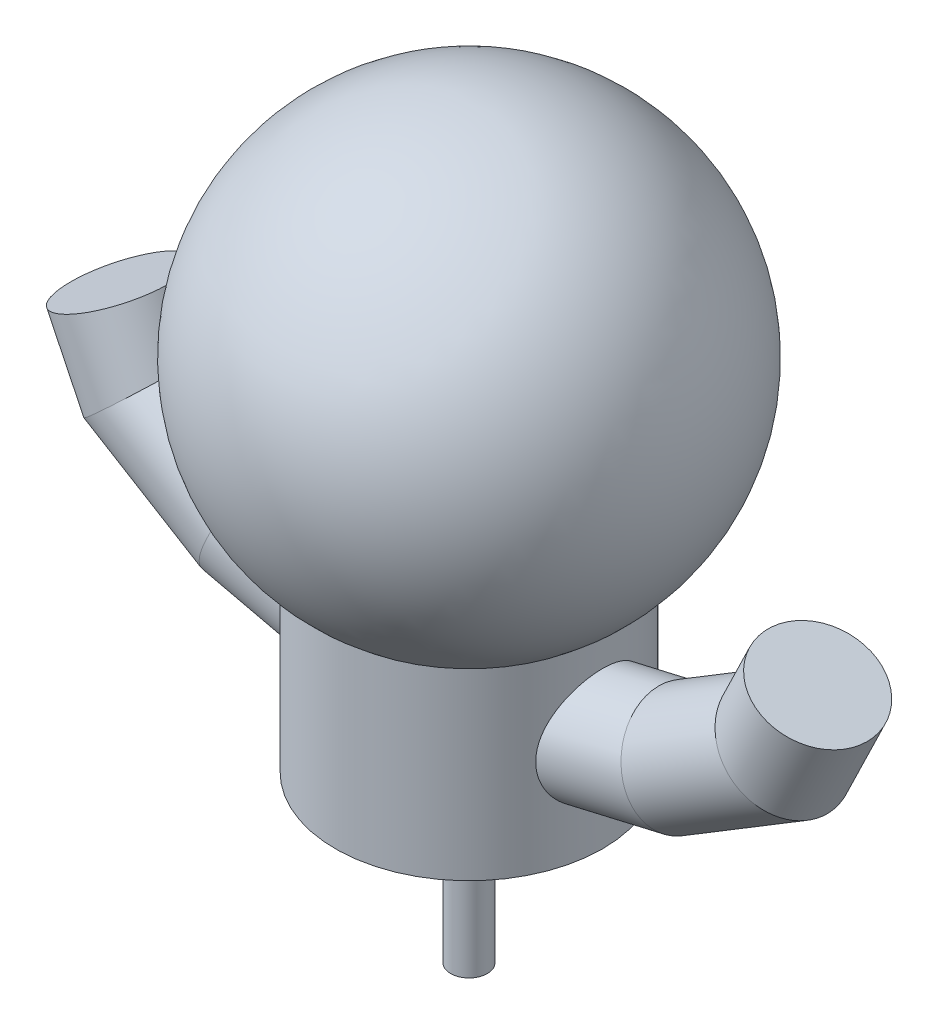
ISO-10303-21;
HEADER;
FILE_DESCRIPTION(('STEP AP214'),'2;1');
FILE_NAME('part.step','',(''),(''),'','','');
FILE_SCHEMA(('AUTOMOTIVE_DESIGN { 1 0 10303 214 1 1 1 1 }'));
ENDSEC;
DATA;
#1=APPLICATION_CONTEXT('core data for automotive mechanical design processes');
#2=APPLICATION_PROTOCOL_DEFINITION('international standard','automotive_design',2000,#1);
#3=PRODUCT_CONTEXT('',#1,'mechanical');
#4=PRODUCT('Part','Part','',(#3));
#5=PRODUCT_RELATED_PRODUCT_CATEGORY('part','',(#4));
#6=PRODUCT_DEFINITION_FORMATION('','',#4);
#7=PRODUCT_DEFINITION_CONTEXT('part definition',#1,'design');
#8=PRODUCT_DEFINITION('design','',#6,#7);
#9=PRODUCT_DEFINITION_SHAPE('','',#8);
#10=(LENGTH_UNIT() NAMED_UNIT(*) SI_UNIT(.MILLI.,.METRE.));
#11=(NAMED_UNIT(*) PLANE_ANGLE_UNIT() SI_UNIT($,.RADIAN.));
#12=(NAMED_UNIT(*) SI_UNIT($,.STERADIAN.) SOLID_ANGLE_UNIT());
#13=UNCERTAINTY_MEASURE_WITH_UNIT(LENGTH_MEASURE(1.E-05),#10,'distance_accuracy_value','');
#14=(GEOMETRIC_REPRESENTATION_CONTEXT(3) GLOBAL_UNCERTAINTY_ASSIGNED_CONTEXT((#13)) GLOBAL_UNIT_ASSIGNED_CONTEXT((#10,
#11,#12)) REPRESENTATION_CONTEXT('',''));
#15=CARTESIAN_POINT('',(0.,0.,0.));
#16=DIRECTION('',(0.,0.,1.));
#17=DIRECTION('',(1.,0.,0.));
#18=AXIS2_PLACEMENT_3D('',#15,#16,#17);
#19=CARTESIAN_POINT('',(0.,0.,0.));
#20=DIRECTION('',(0.,-1.,0.));
#21=DIRECTION('',(1.,0.,0.));
#22=AXIS2_PLACEMENT_3D('',#19,#20,#21);
#23=SPHERICAL_SURFACE('',#22,6.);
#24=CARTESIAN_POINT('',(0.,-4.76969600708473,0.));
#25=DIRECTION('',(0.,-1.,0.));
#26=DIRECTION('',(1.,0.,0.));
#27=AXIS2_PLACEMENT_3D('',#24,#25,#26);
#28=CIRCLE('',#27,3.64005494464026);
#29=CARTESIAN_POINT('',(3.64005494464026,-4.76969600708473,0.));
#30=VERTEX_POINT('',#29);
#31=EDGE_CURVE('E130',#30,#30,#28,.T.);
#32=ORIENTED_EDGE('',*,*,#31,.F.);
#33=EDGE_LOOP('',(#32));
#34=FACE_BOUND('',#33,.T.);
#35=ADVANCED_FACE('F52',(#34),#23,.T.);
#36=CARTESIAN_POINT('',(0.,0.,0.));
#37=DIRECTION('',(0.,-1.,0.));
#38=DIRECTION('',(1.,0.,0.));
#39=AXIS2_PLACEMENT_3D('',#36,#37,#38);
#40=CYLINDRICAL_SURFACE('',#39,3.64005494464026);
#41=CARTESIAN_POINT('',(-3.64005494464026,-8.59607727363371,0.));
#42=CARTESIAN_POINT('',(-3.64005134271099,-8.59607407344237,0.0835690940158541));
#43=CARTESIAN_POINT('',(-3.63714720886896,-8.58955207200604,0.167246571966957));
#44=CARTESIAN_POINT('',(-3.62580345714482,-8.56359165513654,0.332300949752981));
#45=CARTESIAN_POINT('',(-3.61735242224687,-8.54412659832796,0.41367274273313));
#46=CARTESIAN_POINT('',(-3.5957769928552,-8.49275472153984,0.571600855199424));
#47=CARTESIAN_POINT('',(-3.58265975892055,-8.46086695784621,0.648164342679608));
#48=CARTESIAN_POINT('',(-3.55307306152884,-8.3853379603814,0.794512721836508));
#49=CARTESIAN_POINT('',(-3.5366044789548,-8.34169981415963,0.864299387656839));
#50=CARTESIAN_POINT('',(-3.50179637303754,-8.24294106788351,0.996053851440424));
#51=CARTESIAN_POINT('',(-3.4834369637112,-8.18769033166273,1.05791901767543));
#52=CARTESIAN_POINT('',(-3.44703927918594,-8.06715831932314,1.17109400325693));
#53=CARTESIAN_POINT('',(-3.42900098304577,-8.00187769999261,1.2224045132413));
#54=CARTESIAN_POINT('',(-3.39564705753739,-7.86390703742525,1.31219198271849));
#55=CARTESIAN_POINT('',(-3.38029292741164,-7.79135029683467,1.35085882868813));
#56=CARTESIAN_POINT('',(-3.35384526821888,-7.64000743778165,1.415254464205));
#57=CARTESIAN_POINT('',(-3.34274943943768,-7.56122470949359,1.44099023956226));
#58=CARTESIAN_POINT('',(-3.32657775610414,-7.40418178226307,1.47792663684957));
#59=CARTESIAN_POINT('',(-3.32121514913378,-7.32611335602492,1.48982255615068));
#60=CARTESIAN_POINT('',(-3.31592869559485,-7.16890670272557,1.50155197479597));
#61=CARTESIAN_POINT('',(-3.31600551127798,-7.08976834657274,1.50138400535723));
#62=CARTESIAN_POINT('',(-3.32135548330058,-6.93198874451914,1.48950866492087));
#63=CARTESIAN_POINT('',(-3.32666706510584,-6.85335550338628,1.47771596317766));
#64=CARTESIAN_POINT('',(-3.34173493070549,-6.69895027846491,1.44331379012822));
#65=CARTESIAN_POINT('',(-3.35149286372745,-6.62317936766654,1.42070030505254));
#66=CARTESIAN_POINT('',(-3.37559637586218,-6.46792206623965,1.36251376003788));
#67=CARTESIAN_POINT('',(-3.39032436420688,-6.38892208447144,1.32580235420734));
#68=CARTESIAN_POINT('',(-3.42224330113159,-6.23770533281707,1.24108716696404));
#69=CARTESIAN_POINT('',(-3.43943657138977,-6.16549506449303,1.193072713243));
#70=CARTESIAN_POINT('',(-3.47635461223282,-6.02253573851541,1.08110075545232));
#71=CARTESIAN_POINT('',(-3.49615904925927,-5.95268146342705,1.01601871368585));
#72=CARTESIAN_POINT('',(-3.5343004811491,-5.82563619426501,0.874123831088594));
#73=CARTESIAN_POINT('',(-3.55263906410411,-5.76843137383105,0.797323955112624));
#74=CARTESIAN_POINT('',(-3.58204977274425,-5.67984880152984,0.650611071648093));
#75=CARTESIAN_POINT('',(-3.59383989179968,-5.64557376573318,0.582590283147357));
#76=CARTESIAN_POINT('',(-3.61388568553978,-5.58830303599787,0.441466369275734));
#77=CARTESIAN_POINT('',(-3.62214433467646,-5.5652978474141,0.36836758152474));
#78=CARTESIAN_POINT('',(-3.63426391424514,-5.53178609483416,0.218607191437487));
#79=CARTESIAN_POINT('',(-3.63810402920059,-5.52133867961148,0.141930481913186));
#80=CARTESIAN_POINT('',(-3.64084926514996,-5.51385407138768,-0.0121655350369675));
#81=CARTESIAN_POINT('',(-3.6397553008023,-5.51681439291841,-0.0895847021741608));
#82=CARTESIAN_POINT('',(-3.63305131367646,-5.53516558637919,-0.236479829783757));
#83=CARTESIAN_POINT('',(-3.6278039404992,-5.54955857295678,-0.306100993177752));
#84=CARTESIAN_POINT('',(-3.61377071465294,-5.58873570120773,-0.441960846283877));
#85=CARTESIAN_POINT('',(-3.60498426912019,-5.61352158392278,-0.508198967174374));
#86=CARTESIAN_POINT('',(-3.5841964165547,-5.67368788120705,-0.638836394583466));
#87=CARTESIAN_POINT('',(-3.57206721965398,-5.70949799579491,-0.703015883566969));
#88=CARTESIAN_POINT('',(-3.54583875411319,-5.78984467461402,-0.825190435953852));
#89=CARTESIAN_POINT('',(-3.53173863504565,-5.83438500917746,-0.883182810549112));
#90=CARTESIAN_POINT('',(-3.50052931041012,-5.93790707897939,-1.00023817890334));
#91=CARTESIAN_POINT('',(-3.48328002412369,-5.99804604610502,-1.05824031018409));
#92=CARTESIAN_POINT('',(-3.44917694150512,-6.12645221876781,-1.1646048106477));
#93=CARTESIAN_POINT('',(-3.43232348843751,-6.19472618844312,-1.21295906715633));
#94=CARTESIAN_POINT('',(-3.3985272548193,-6.34719172887997,-1.30488005114661));
#95=CARTESIAN_POINT('',(-3.38185109373607,-6.43230142750177,-1.34703391620695));
#96=CARTESIAN_POINT('',(-3.35316995669626,-6.60902652715516,-1.41692908096207));
#97=CARTESIAN_POINT('',(-3.34116485841944,-6.70064175775331,-1.44467075807246));
#98=CARTESIAN_POINT('',(-3.32392384890707,-6.88642018818435,-1.48391120329772));
#99=CARTESIAN_POINT('',(-3.31858188576581,-6.9805184631374,-1.49566472381707));
#100=CARTESIAN_POINT('',(-3.31557095609376,-7.16940898711521,-1.50233728309675));
#101=CARTESIAN_POINT('',(-3.31789224530079,-7.26420020202618,-1.49727770062203));
#102=CARTESIAN_POINT('',(-3.32942170383373,-7.43892569624402,-1.47143014293076));
#103=CARTESIAN_POINT('',(-3.3377267869483,-7.51922886951134,-1.45270082697048));
#104=CARTESIAN_POINT('',(-3.3592703191043,-7.67490594894049,-1.40215989858955));
#105=CARTESIAN_POINT('',(-3.37250837357849,-7.75028024877514,-1.37034933246098));
#106=CARTESIAN_POINT('',(-3.40153149222102,-7.89008168940454,-1.29655706880628));
#107=CARTESIAN_POINT('',(-3.41714568629201,-7.95487631524828,-1.25519931432179));
#108=CARTESIAN_POINT('',(-3.44972321287994,-8.07663452419111,-1.16267403298825));
#109=CARTESIAN_POINT('',(-3.4666866404259,-8.13359755492415,-1.11150581481147));
#110=CARTESIAN_POINT('',(-3.50104879969816,-8.24098261198177,-0.998155062724675));
#111=CARTESIAN_POINT('',(-3.51843288222428,-8.29099615289931,-0.935581165762407));
#112=CARTESIAN_POINT('',(-3.55110429190529,-8.38038775958931,-0.802706537963184));
#113=CARTESIAN_POINT('',(-3.56639030409198,-8.41975917024047,-0.732401010582463));
#114=CARTESIAN_POINT('',(-3.59386024464513,-8.48830453051474,-0.583205059555492));
#115=CARTESIAN_POINT('',(-3.60591080678036,-8.51705451636795,-0.504095135829281));
#116=CARTESIAN_POINT('',(-3.62488450324746,-8.56158343026559,-0.341835888366846));
#117=CARTESIAN_POINT('',(-3.63181844943693,-8.57738971728667,-0.258695480151701));
#118=CARTESIAN_POINT('',(-3.63725109731717,-8.58973206147873,-0.14579657611972));
#119=CARTESIAN_POINT('',(-3.63830051798698,-8.59210986807378,-0.116701696257366));
#120=CARTESIAN_POINT('',(-3.63970307218496,-8.59528303577263,-0.0584089586246372));
#121=CARTESIAN_POINT('',(-3.64005620367411,-8.59607839224235,-0.0292111005529483));
#122=CARTESIAN_POINT('',(-3.64005494464026,-8.59607727363371,0.));
#123=B_SPLINE_CURVE_WITH_KNOTS('',3,(#41,#42,#43,#44,#45,#46,#47,#48,#49,#50,#51,#52,#53,#54,
#55,#56,#57,#58,#59,#60,#61,#62,#63,#64,#65,#66,#67,#68,#69,#70,#71,#72,#73,#74,#75,#76,#77,#78,
#79,#80,#81,#82,#83,#84,#85,#86,#87,#88,#89,#90,#91,#92,#93,#94,#95,#96,#97,#98,#99,#100,#101,
#102,#103,#104,#105,#106,#107,#108,#109,#110,#111,#112,#113,#114,#115,#116,#117,#118,#119,#120,
#121,#122),.UNSPECIFIED.,.T.,.F.,(4,2,2,2,2,2,2,2,2,2,2,2,2,2,2,2,2,2,2,2,2,2,2,2,2,2,2,2,2,2,2,
2,2,2,2,2,2,2,2,2,4),(0.,0.250595032176578,0.501707480720927,0.752436232957427,1.00309916748549,
1.25673718116394,1.51035859290116,1.75997447070413,2.00945535202431,2.24577232954304,
2.48211807878991,2.72021172892935,2.95839376404678,3.22237253898773,3.48660156883981,
3.77769147390713,4.06846161579711,4.29872816326529,4.52880038021484,4.759952073764,
4.99106091916756,5.20395881686657,5.41689239396551,5.63948794840792,5.86217984815979,
6.11711696417195,6.37226755573091,6.66019354510001,6.94811199409815,7.23138684328873,
7.51430163116933,7.76162646562468,8.0089315218713,8.24321133281505,8.47750765915507,
8.72232301152972,8.96729110833411,9.22118749293776,9.47454582373419,9.56213963257862,
9.64973369793478),.UNSPECIFIED.);
#124=CARTESIAN_POINT('',(-3.64005494464026,-8.59607727363371,0.));
#125=VERTEX_POINT('',#124);
#126=EDGE_CURVE('E12',#125,#125,#123,.T.);
#127=ORIENTED_EDGE('',*,*,#126,.F.);
#128=EDGE_LOOP('',(#127));
#129=FACE_BOUND('',#128,.T.);
#130=CARTESIAN_POINT('',(3.64005494464026,-5.5160205218229,0.));
#131=CARTESIAN_POINT('',(3.64005206407755,-5.51602561847694,0.075332153520379));
#132=CARTESIAN_POINT('',(3.6376875742345,-5.52244083422874,0.150788612179093));
#133=CARTESIAN_POINT('',(3.62848943879027,-5.54771789245026,0.29940219232951));
#134=CARTESIAN_POINT('',(3.62164461072528,-5.56661087921812,0.372553079249521));
#135=CARTESIAN_POINT('',(3.60427548610926,-5.61561452748231,0.514057809054224));
#136=CARTESIAN_POINT('',(3.59377083954549,-5.64566533687485,0.582434974862623));
#137=CARTESIAN_POINT('',(3.57008414534517,-5.71556420675062,0.713397481154407));
#138=CARTESIAN_POINT('',(3.5569025305712,-5.75541068350507,0.77598375563947));
#139=CARTESIAN_POINT('',(3.52782640316797,-5.84706055047559,0.899319350649689));
#140=CARTESIAN_POINT('',(3.5117986674186,-5.89957066548856,0.959510015956166));
#141=CARTESIAN_POINT('',(3.47928475817384,-6.01282466149621,1.07143866491105));
#142=CARTESIAN_POINT('',(3.46279828190979,-6.07357408805382,1.12317090334726));
#143=CARTESIAN_POINT('',(3.4283163710591,-6.21165869072769,1.22472087883033));
#144=CARTESIAN_POINT('',(3.41046820492509,-6.29011356395069,1.27307395856151));
#145=CARTESIAN_POINT('',(3.3780201049491,-6.45433641151377,1.3568360157967));
#146=CARTESIAN_POINT('',(3.3634219396578,-6.54010833262504,1.39223795239291));
#147=CARTESIAN_POINT('',(3.3390334892627,-6.72000636901913,1.449784748987));
#148=CARTESIAN_POINT('',(3.32942395873215,-6.81431755284925,1.4714368334028));
#149=CARTESIAN_POINT('',(3.31761150602155,-7.00570947528485,1.49789296971459));
#150=CARTESIAN_POINT('',(3.31539910604132,-7.10278650900302,1.50271858138491));
#151=CARTESIAN_POINT('',(3.31897197921092,-7.28517511380399,1.49480098073752));
#152=CARTESIAN_POINT('',(3.32388927561267,-7.37058669608874,1.48396492160292));
#153=CARTESIAN_POINT('',(3.33976870817501,-7.53771628016345,1.44787106926828));
#154=CARTESIAN_POINT('',(3.35072856241568,-7.61943566368365,1.4226187201284));
#155=CARTESIAN_POINT('',(3.37612952773533,-7.76949868990039,1.36115433360866));
#156=CARTESIAN_POINT('',(3.39018104740495,-7.83838685940344,1.32609765488617));
#157=CARTESIAN_POINT('',(3.42062848671948,-7.96911350767591,1.24545314015555));
#158=CARTESIAN_POINT('',(3.43702468080793,-8.03095115965903,1.19986407094875));
#159=CARTESIAN_POINT('',(3.47092344237607,-8.14782881441846,1.09801632990885));
#160=CARTESIAN_POINT('',(3.48844385523404,-8.20264350326018,1.04150549724072));
#161=CARTESIAN_POINT('',(3.52240964296511,-8.30245989814092,0.920109456382534));
#162=CARTESIAN_POINT('',(3.53885478119316,-8.34745944913298,0.855222414050069));
#163=CARTESIAN_POINT('',(3.56980491688371,-8.42870088566679,0.715435880337415));
#164=CARTESIAN_POINT('',(3.58418152427537,-8.46442849372465,0.640208161096084));
#165=CARTESIAN_POINT('',(3.60854755953393,-8.52345971992588,0.484357678447985));
#166=CARTESIAN_POINT('',(3.618537041876,-8.54676349233745,0.403734982045257));
#167=CARTESIAN_POINT('',(3.63311955947945,-8.58042452948414,0.239286428738883));
#168=CARTESIAN_POINT('',(3.63770849234972,-8.59077195263661,0.155458186664315));
#169=CARTESIAN_POINT('',(3.64100539184216,-8.59822752215712,-0.0128952448507212));
#170=CARTESIAN_POINT('',(3.63971388909882,-8.59533686309348,-0.0974203707192377));
#171=CARTESIAN_POINT('',(3.63144923888713,-8.57654038089901,-0.263395809377436));
#172=CARTESIAN_POINT('',(3.62456389743933,-8.56083568233813,-0.344873428507342));
#173=CARTESIAN_POINT('',(3.60590525844523,-8.51703678599593,-0.503840767634385));
#174=CARTESIAN_POINT('',(3.59413153805895,-8.48894151642931,-0.581330142000402));
#175=CARTESIAN_POINT('',(3.56673623287665,-8.42066080749181,-0.730909656459056));
#176=CARTESIAN_POINT('',(3.55108113442818,-8.38036935307706,-0.802945232033433));
#177=CARTESIAN_POINT('',(3.51757077928485,-8.28859132165221,-0.938938841256403));
#178=CARTESIAN_POINT('',(3.4997151330199,-8.23710276114512,-1.00289544058779));
#179=CARTESIAN_POINT('',(3.46348578242838,-8.12327382096668,-1.1216830279688));
#180=CARTESIAN_POINT('',(3.44510844957381,-8.06081239278901,-1.17639724491673));
#181=CARTESIAN_POINT('',(3.41018147135059,-7.92686979951978,-1.27411292658893));
#182=CARTESIAN_POINT('',(3.39363113167304,-7.85539208315278,-1.31711884996828));
#183=CARTESIAN_POINT('',(3.36491369506988,-7.70791866934569,-1.38881407430412));
#184=CARTESIAN_POINT('',(3.35261474905273,-7.63216487102751,-1.41794725347008));
#185=CARTESIAN_POINT('',(3.33308439154402,-7.47627877517531,-1.46327245267323));
#186=CARTESIAN_POINT('',(3.32585119049142,-7.39614803466573,-1.47946904306589));
#187=CARTESIAN_POINT('',(3.31737053257249,-7.23765071625341,-1.4983834677057));
#188=CARTESIAN_POINT('',(3.31587191378812,-7.15936343003437,-1.50166705003416));
#189=CARTESIAN_POINT('',(3.31808936749014,-7.00323707184262,-1.49675882617192));
#190=CARTESIAN_POINT('',(3.32180688191296,-6.92539812978258,-1.48856384687388));
#191=CARTESIAN_POINT('',(3.3341029910931,-6.76844838162318,-1.4608198044599));
#192=CARTESIAN_POINT('',(3.34289892497179,-6.68944586681702,-1.44076205108));
#193=CARTESIAN_POINT('',(3.36438142213141,-6.53556283091164,-1.38985454962886));
#194=CARTESIAN_POINT('',(3.37706983878496,-6.46068429348547,-1.358999659606));
#195=CARTESIAN_POINT('',(3.40677085027455,-6.30742799255783,-1.28287998240655));
#196=CARTESIAN_POINT('',(3.42412439903201,-6.22976577858891,-1.2363036362654));
#197=CARTESIAN_POINT('',(3.4601816345181,-6.08302796002916,-1.13146545114868));
#198=CARTESIAN_POINT('',(3.47888646839146,-6.0139597898371,-1.07319360711102));
#199=CARTESIAN_POINT('',(3.51676283389293,-5.88257215985816,-0.941975531068552));
#200=CARTESIAN_POINT('',(3.53589531794094,-5.82090383029634,-0.868359862270871));
#201=CARTESIAN_POINT('',(3.5710006020928,-5.71232718644217,-0.710256779020208));
#202=CARTESIAN_POINT('',(3.58697772763944,-5.66539861365627,-0.625784513169807));
#203=CARTESIAN_POINT('',(3.61016708870077,-5.59880840635672,-0.470385054469701));
#204=CARTESIAN_POINT('',(3.61856998220217,-5.57527265365965,-0.401281447357137));
#205=CARTESIAN_POINT('',(3.63144805196664,-5.53951571482703,-0.259958833576038));
#206=CARTESIAN_POINT('',(3.6359346357854,-5.52726166124362,-0.187749522395355));
#207=CARTESIAN_POINT('',(3.63884145886494,-5.51932853197513,-0.0959363664743382));
#208=CARTESIAN_POINT('',(3.63929569957311,-5.51808950540125,-0.0767763925971019));
#209=CARTESIAN_POINT('',(3.63990283154662,-5.51643479092332,-0.0384136443127323));
#210=CARTESIAN_POINT('',(3.6400556792283,-5.5160192220973,-0.0192108641173801));
#211=CARTESIAN_POINT('',(3.64005494464026,-5.5160205218229,0.));
#212=B_SPLINE_CURVE_WITH_KNOTS('',3,(#130,#131,#132,#133,#134,#135,#136,#137,#138,#139,#140,
#141,#142,#143,#144,#145,#146,#147,#148,#149,#150,#151,#152,#153,#154,#155,#156,#157,#158,#159,
#160,#161,#162,#163,#164,#165,#166,#167,#168,#169,#170,#171,#172,#173,#174,#175,#176,#177,#178,
#179,#180,#181,#182,#183,#184,#185,#186,#187,#188,#189,#190,#191,#192,#193,#194,#195,#196,#197,
#198,#199,#200,#201,#202,#203,#204,#205,#206,#207,#208,#209,#210,#211),.UNSPECIFIED.,.T.,.F.,(4,
2,2,2,2,2,2,2,2,2,2,2,2,2,2,2,2,2,2,2,2,2,2,2,2,2,2,2,2,2,2,2,2,2,2,2,2,2,2,2,4),(0.,
0.225914104423408,0.452394228384957,0.677676631500902,0.902922635682854,1.14639914301043,
1.39004034583779,1.67041605282258,1.95094396074425,2.24102969898867,2.53074361326523,
2.78800996679492,3.04517923238289,3.27979524037599,3.51443873262502,3.75534100799938,
3.99629612361785,4.24863661813012,4.50097397922858,4.75350289856451,5.0060090308307,
5.25462646278348,5.50326540438148,5.75413092035847,6.00504091183691,6.25891597175021,
6.51269421741008,6.75769155574265,7.00260230085981,7.23665486057815,7.47077213402186,
7.7157414930469,7.96082767366509,8.23627396736519,8.51195690720555,8.80413609581394,
9.09591193468221,9.31545739111601,9.53436119361981,9.5919644546353,9.64957604489873),.UNSPECIFIED.);
#213=CARTESIAN_POINT('',(3.64005494464026,-5.5160205218229,0.));
#214=VERTEX_POINT('',#213);
#215=EDGE_CURVE('E67',#214,#214,#212,.T.);
#216=ORIENTED_EDGE('',*,*,#215,.F.);
#217=EDGE_LOOP('',(#216));
#218=FACE_BOUND('',#217,.T.);
#219=ORIENTED_EDGE('',*,*,#31,.T.);
#220=EDGE_LOOP('',(#219));
#221=FACE_BOUND('',#220,.T.);
#222=CARTESIAN_POINT('',(0.,-9.76969600708473,0.));
#223=DIRECTION('',(0.,-1.,0.));
#224=DIRECTION('',(1.,0.,0.));
#225=AXIS2_PLACEMENT_3D('',#222,#223,#224);
#226=CIRCLE('',#225,3.64005494464026);
#227=CARTESIAN_POINT('',(3.64005494464026,-9.76969600708473,0.));
#228=VERTEX_POINT('',#227);
#229=EDGE_CURVE('E126',#228,#228,#226,.T.);
#230=ORIENTED_EDGE('',*,*,#229,.F.);
#231=EDGE_LOOP('',(#230));
#232=FACE_BOUND('',#231,.T.);
#233=ADVANCED_FACE('F139',(#129,#218,#221,#232),#40,.T.);
#234=CARTESIAN_POINT('',(0.500000000000001,-9.76969600708473,0.));
#235=DIRECTION('',(0.,-1.,0.));
#236=DIRECTION('',(1.,0.,0.));
#237=AXIS2_PLACEMENT_3D('',#234,#235,#236);
#238=PLANE('',#237);
#239=ORIENTED_EDGE('',*,*,#229,.T.);
#240=EDGE_LOOP('',(#239));
#241=FACE_BOUND('',#240,.T.);
#242=CARTESIAN_POINT('',(0.,-9.76969600708473,0.));
#243=DIRECTION('',(0.,-1.,0.));
#244=DIRECTION('',(1.,0.,0.));
#245=AXIS2_PLACEMENT_3D('',#242,#243,#244);
#246=CIRCLE('',#245,0.500000000000002);
#247=CARTESIAN_POINT('',(0.500000000000001,-9.76969600708473,0.));
#248=VERTEX_POINT('',#247);
#249=EDGE_CURVE('E122',#248,#248,#246,.T.);
#250=ORIENTED_EDGE('',*,*,#249,.F.);
#251=EDGE_LOOP('',(#250));
#252=FACE_BOUND('',#251,.T.);
#253=ADVANCED_FACE('F179',(#241,#252),#238,.T.);
#254=CARTESIAN_POINT('',(0.,0.,0.));
#255=DIRECTION('',(0.,-1.,0.));
#256=DIRECTION('',(1.,0.,0.));
#257=AXIS2_PLACEMENT_3D('',#254,#255,#256);
#258=CYLINDRICAL_SURFACE('',#257,0.500000000000003);
#259=ORIENTED_EDGE('',*,*,#249,.T.);
#260=EDGE_LOOP('',(#259));
#261=FACE_BOUND('',#260,.T.);
#262=CARTESIAN_POINT('',(0.,-14.2830949562693,0.));
#263=DIRECTION('',(0.,-1.,0.));
#264=DIRECTION('',(1.,0.,0.));
#265=AXIS2_PLACEMENT_3D('',#262,#263,#264);
#266=CIRCLE('',#265,0.500000000000003);
#267=CARTESIAN_POINT('',(0.500000000000001,-14.2830949562693,0.));
#268=VERTEX_POINT('',#267);
#269=EDGE_CURVE('E102',#268,#268,#266,.T.);
#270=ORIENTED_EDGE('',*,*,#269,.F.);
#271=EDGE_LOOP('',(#270));
#272=FACE_BOUND('',#271,.T.);
#273=ADVANCED_FACE('F176',(#261,#272),#258,.T.);
#274=CARTESIAN_POINT('',(0.,-14.2830949562693,0.));
#275=DIRECTION('',(0.,-1.,0.));
#276=DIRECTION('',(1.,0.,0.));
#277=AXIS2_PLACEMENT_3D('',#274,#275,#276);
#278=PLANE('',#277);
#279=ORIENTED_EDGE('',*,*,#269,.T.);
#280=EDGE_LOOP('',(#279));
#281=FACE_BOUND('',#280,.T.);
#282=ADVANCED_FACE('F165',(#281),#278,.T.);
#283=CARTESIAN_POINT('',(9.49641968959369,-2.98093408800248,0.));
#284=DIRECTION('',(-0.436863709321757,-0.899527709121645,0.));
#285=DIRECTION('',(0.899527709121645,-0.436863709321757,0.));
#286=AXIS2_PLACEMENT_3D('',#283,#284,#285);
#287=PLANE('',#286);
#288=CARTESIAN_POINT('',(9.49641968959369,-2.98093408800248,0.));
#289=DIRECTION('',(-0.436863709321757,-0.899527709121645,0.));
#290=DIRECTION('',(0.899527709121645,-0.436863709321757,0.));
#291=AXIS2_PLACEMENT_3D('',#288,#289,#290);
#292=CIRCLE('',#291,1.5);
#293=CARTESIAN_POINT('',(10.8457112532762,-3.63622965198512,0.));
#294=VERTEX_POINT('',#293);
#295=EDGE_CURVE('E97',#294,#294,#292,.T.);
#296=ORIENTED_EDGE('',*,*,#295,.F.);
#297=EDGE_LOOP('',(#296));
#298=FACE_BOUND('',#297,.T.);
#299=ADVANCED_FACE('F161',(#298),#287,.F.);
#300=CARTESIAN_POINT('',(9.49641968959369,-2.98093408800248,0.));
#301=DIRECTION('',(-0.436863709321756,-0.899527709121646,0.));
#302=DIRECTION('',(0.899527709121646,-0.436863709321756,0.));
#303=AXIS2_PLACEMENT_3D('',#300,#301,#302);
#304=CYLINDRICAL_SURFACE('',#303,1.5);
#305=ORIENTED_EDGE('',*,*,#295,.T.);
#306=EDGE_LOOP('',(#305));
#307=FACE_BOUND('',#306,.T.);
#308=CARTESIAN_POINT('',(8.59559939861225,-4.8357753013751,0.));
#309=DIRECTION('',(-0.673272022440771,-0.73939487677324,0.));
#310=DIRECTION('',(0.73939487677324,-0.673272022440771,0.));
#311=AXIS2_PLACEMENT_3D('',#308,#309,#310);
#312=ELLIPSE('',#311,1.56374726314852,1.5);
#313=CARTESIAN_POINT('',(9.75182611355244,-5.88860258382133,0.));
#314=VERTEX_POINT('',#313);
#315=EDGE_CURVE('E91',#314,#314,#312,.F.);
#316=ORIENTED_EDGE('',*,*,#315,.T.);
#317=EDGE_LOOP('',(#316));
#318=FACE_BOUND('',#317,.T.);
#319=ADVANCED_FACE('F164',(#307,#318),#304,.T.);
#320=CARTESIAN_POINT('',(9.09661361506973,-4.53158809852592,0.));
#321=DIRECTION('',(-0.854787515221729,-0.518978134241764,0.));
#322=DIRECTION('',(0.518978134241764,-0.854787515221729,0.));
#323=AXIS2_PLACEMENT_3D('',#320,#321,#322);
#324=CYLINDRICAL_SURFACE('',#323,1.5);
#325=ORIENTED_EDGE('',*,*,#315,.F.);
#326=EDGE_LOOP('',(#325));
#327=FACE_BOUND('',#326,.T.);
#328=CARTESIAN_POINT('',(5.74491877134595,-6.56654568221536,0.));
#329=DIRECTION('',(-0.9260168331082,-0.377482217859676,0.));
#330=DIRECTION('',(0.377482217859676,-0.9260168331082,0.));
#331=AXIS2_PLACEMENT_3D('',#328,#329,#330);
#332=ELLIPSE('',#331,1.51906018749921,1.5);
#333=CARTESIAN_POINT('',(6.31833697998549,-7.97322098634412,0.));
#334=VERTEX_POINT('',#333);
#335=EDGE_CURVE('E105',#334,#334,#332,.F.);
#336=ORIENTED_EDGE('',*,*,#335,.T.);
#337=EDGE_LOOP('',(#336));
#338=FACE_BOUND('',#337,.T.);
#339=ADVANCED_FACE('F92',(#327,#338),#324,.T.);
#340=CARTESIAN_POINT('',(6.09933233736391,-6.48412392267629,0.));
#341=DIRECTION('',(-0.974008027039197,-0.226513494660279,0.));
#342=DIRECTION('',(0.226513494660279,-0.974008027039197,0.));
#343=AXIS2_PLACEMENT_3D('',#340,#341,#342);
#344=CYLINDRICAL_SURFACE('',#343,1.5);
#345=ORIENTED_EDGE('',*,*,#215,.T.);
#346=EDGE_LOOP('',(#345));
#347=FACE_BOUND('',#346,.T.);
#348=ORIENTED_EDGE('',*,*,#335,.F.);
#349=EDGE_LOOP('',(#348));
#350=FACE_BOUND('',#349,.T.);
#351=ADVANCED_FACE('F142',(#347,#350),#344,.T.);
#352=CARTESIAN_POINT('',(-9.49641968959369,-2.98093408800248,0.));
#353=DIRECTION('',(-0.436863709321756,0.899527709121646,0.));
#354=DIRECTION('',(-0.899527709121645,-0.436863709321756,0.));
#355=AXIS2_PLACEMENT_3D('',#352,#353,#354);
#356=PLANE('',#355);
#357=CARTESIAN_POINT('',(-9.49641968959369,-2.98093408800248,0.));
#358=DIRECTION('',(-0.436863709321756,0.899527709121646,0.));
#359=DIRECTION('',(-0.899527709121645,-0.436863709321756,0.));
#360=AXIS2_PLACEMENT_3D('',#357,#358,#359);
#361=CIRCLE('',#360,1.5);
#362=CARTESIAN_POINT('',(-10.8457112532762,-3.63622965198512,0.));
#363=VERTEX_POINT('',#362);
#364=EDGE_CURVE('E72',#363,#363,#361,.T.);
#365=ORIENTED_EDGE('',*,*,#364,.T.);
#366=EDGE_LOOP('',(#365));
#367=FACE_BOUND('',#366,.T.);
#368=ADVANCED_FACE('F146',(#367),#356,.T.);
#369=CARTESIAN_POINT('',(-8.33954169406357,-5.36301296259721,0.));
#370=DIRECTION('',(-0.436863709321756,0.899527709121646,0.));
#371=DIRECTION('',(-0.899527709121646,-0.436863709321756,0.));
#372=AXIS2_PLACEMENT_3D('',#369,#370,#371);
#373=CYLINDRICAL_SURFACE('',#372,1.5);
#374=CARTESIAN_POINT('',(-8.59559939861225,-4.8357753013751,0.));
#375=DIRECTION('',(-0.673272022440771,0.73939487677324,0.));
#376=DIRECTION('',(-0.73939487677324,-0.673272022440771,0.));
#377=AXIS2_PLACEMENT_3D('',#374,#375,#376);
#378=ELLIPSE('',#377,1.56374726314852,1.5);
#379=CARTESIAN_POINT('',(-9.75182611355244,-5.88860258382132,0.));
#380=VERTEX_POINT('',#379);
#381=EDGE_CURVE('E77',#380,#380,#378,.F.);
#382=ORIENTED_EDGE('',*,*,#381,.F.);
#383=EDGE_LOOP('',(#382));
#384=FACE_BOUND('',#383,.T.);
#385=ORIENTED_EDGE('',*,*,#364,.F.);
#386=EDGE_LOOP('',(#385));
#387=FACE_BOUND('',#386,.T.);
#388=ADVANCED_FACE('F157',(#384,#387),#373,.T.);
#389=CARTESIAN_POINT('',(-5.43388612782836,-6.75538693006532,0.));
#390=DIRECTION('',(-0.854787515221729,0.518978134241764,0.));
#391=DIRECTION('',(-0.518978134241764,-0.854787515221729,0.));
#392=AXIS2_PLACEMENT_3D('',#389,#390,#391);
#393=CYLINDRICAL_SURFACE('',#392,1.5);
#394=CARTESIAN_POINT('',(-5.74491877134595,-6.56654568221535,0.));
#395=DIRECTION('',(-0.9260168331082,0.377482217859676,0.));
#396=DIRECTION('',(-0.377482217859676,-0.9260168331082,0.));
#397=AXIS2_PLACEMENT_3D('',#394,#395,#396);
#398=ELLIPSE('',#397,1.51906018749921,1.5);
#399=CARTESIAN_POINT('',(-6.31833697998549,-7.97322098634412,0.));
#400=VERTEX_POINT('',#399);
#401=EDGE_CURVE('E111',#400,#400,#398,.F.);
#402=ORIENTED_EDGE('',*,*,#401,.F.);
#403=EDGE_LOOP('',(#402));
#404=FACE_BOUND('',#403,.T.);
#405=ORIENTED_EDGE('',*,*,#381,.T.);
#406=EDGE_LOOP('',(#405));
#407=FACE_BOUND('',#406,.T.);
#408=ADVANCED_FACE('F153',(#404,#407),#393,.T.);
#409=CARTESIAN_POINT('',(-2.83640634250404,-7.24294392148092,0.));
#410=DIRECTION('',(-0.974008027039196,0.226513494660279,0.));
#411=DIRECTION('',(-0.226513494660279,-0.974008027039196,0.));
#412=AXIS2_PLACEMENT_3D('',#409,#410,#411);
#413=CYLINDRICAL_SURFACE('',#412,1.5);
#414=ORIENTED_EDGE('',*,*,#126,.T.);
#415=EDGE_LOOP('',(#414));
#416=FACE_BOUND('',#415,.T.);
#417=ORIENTED_EDGE('',*,*,#401,.T.);
#418=EDGE_LOOP('',(#417));
#419=FACE_BOUND('',#418,.T.);
#420=ADVANCED_FACE('F148',(#416,#419),#413,.T.);
#421=CLOSED_SHELL('',(#35,#233,#253,#273,#282,#299,#319,#339,#351,#368,#388,#408,#420));
#422=CARTESIAN_POINT('',(0.,0.,0.));
#423=DIRECTION('',(0.,-1.,0.));
#424=DIRECTION('',(-1.,0.,0.));
#425=AXIS2_PLACEMENT_3D('',#422,#423,#424);
#426=SPHERICAL_SURFACE('',#425,5.);
#427=CARTESIAN_POINT('',(0.,-4.76969600708473,0.));
#428=DIRECTION('',(0.,-1.,0.));
#429=DIRECTION('',(1.,0.,0.));
#430=AXIS2_PLACEMENT_3D('',#427,#428,#429);
#431=CIRCLE('',#430,1.5);
#432=CARTESIAN_POINT('',(1.5,-4.76969600708473,0.));
#433=VERTEX_POINT('',#432);
#434=EDGE_CURVE('E96',#433,#433,#431,.T.);
#435=ORIENTED_EDGE('',*,*,#434,.T.);
#436=EDGE_LOOP('',(#435));
#437=FACE_BOUND('',#436,.T.);
#438=ADVANCED_FACE('F54',(#437),#426,.F.);
#439=CARTESIAN_POINT('',(1.5,-4.76969600708473,0.));
#440=DIRECTION('',(0.,1.,0.));
#441=DIRECTION('',(-1.,0.,0.));
#442=AXIS2_PLACEMENT_3D('',#439,#440,#441);
#443=PLANE('',#442);
#444=ORIENTED_EDGE('',*,*,#434,.F.);
#445=EDGE_LOOP('',(#444));
#446=FACE_BOUND('',#445,.T.);
#447=ADVANCED_FACE('F169',(#446),#443,.T.);
#448=CLOSED_SHELL('',(#438,#447));
#449=ORIENTED_CLOSED_SHELL('',*,#448,.T.);
#450=BREP_WITH_VOIDS('B2',#421,(#449));
#451=ADVANCED_BREP_SHAPE_REPRESENTATION('',(#18,#450),#14);
#452=SHAPE_DEFINITION_REPRESENTATION(#9,#451);
ENDSEC;
END-ISO-10303-21;
